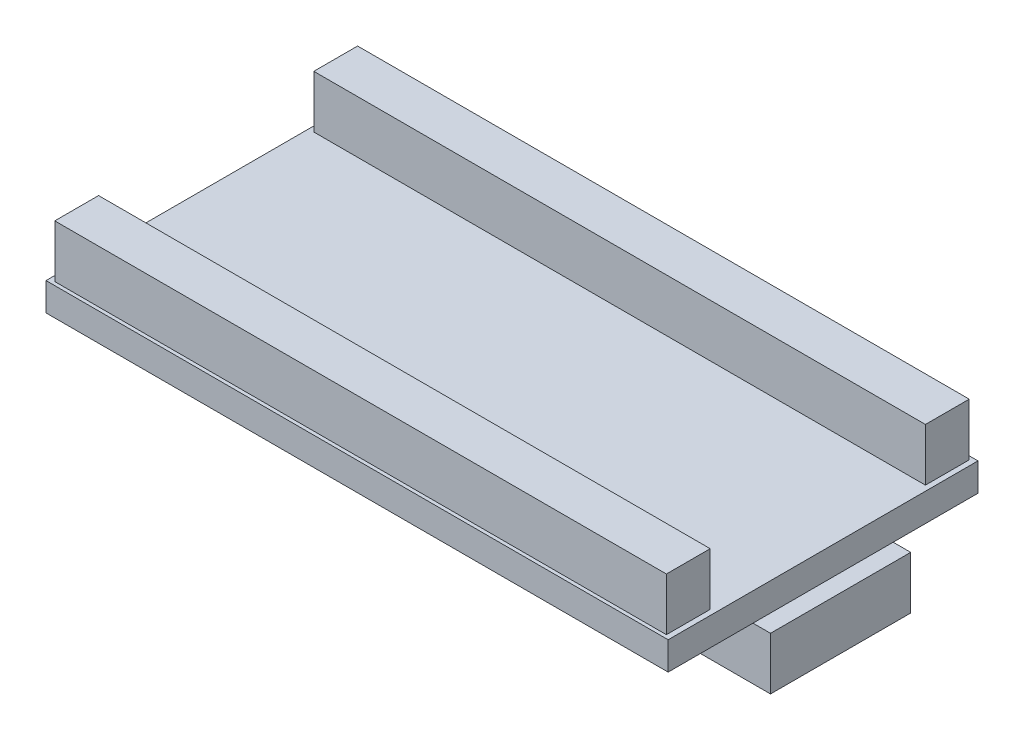
ISO-10303-21;
HEADER;
FILE_DESCRIPTION(('STEP AP214'),'2;1');
FILE_NAME('part.step','',(''),(''),'','','');
FILE_SCHEMA(('AUTOMOTIVE_DESIGN { 1 0 10303 214 1 1 1 1 }'));
ENDSEC;
DATA;
#1=APPLICATION_CONTEXT('core data for automotive mechanical design processes');
#2=APPLICATION_PROTOCOL_DEFINITION('international standard','automotive_design',2000,#1);
#3=PRODUCT_CONTEXT('',#1,'mechanical');
#4=PRODUCT('Part','Part','',(#3));
#5=PRODUCT_RELATED_PRODUCT_CATEGORY('part','',(#4));
#6=PRODUCT_DEFINITION_FORMATION('','',#4);
#7=PRODUCT_DEFINITION_CONTEXT('part definition',#1,'design');
#8=PRODUCT_DEFINITION('design','',#6,#7);
#9=PRODUCT_DEFINITION_SHAPE('','',#8);
#10=(LENGTH_UNIT() NAMED_UNIT(*) SI_UNIT(.MILLI.,.METRE.));
#11=(NAMED_UNIT(*) PLANE_ANGLE_UNIT() SI_UNIT($,.RADIAN.));
#12=(NAMED_UNIT(*) SI_UNIT($,.STERADIAN.) SOLID_ANGLE_UNIT());
#13=UNCERTAINTY_MEASURE_WITH_UNIT(LENGTH_MEASURE(1.E-05),#10,'distance_accuracy_value','');
#14=(GEOMETRIC_REPRESENTATION_CONTEXT(3) GLOBAL_UNCERTAINTY_ASSIGNED_CONTEXT((#13)) GLOBAL_UNIT_ASSIGNED_CONTEXT((#10,
#11,#12)) REPRESENTATION_CONTEXT('',''));
#15=CARTESIAN_POINT('',(0.,0.,0.));
#16=DIRECTION('',(0.,0.,1.));
#17=DIRECTION('',(1.,0.,0.));
#18=AXIS2_PLACEMENT_3D('',#15,#16,#17);
#19=CARTESIAN_POINT('',(0.,0.,0.));
#20=DIRECTION('',(0.,1.,0.));
#21=DIRECTION('',(0.,0.,1.));
#22=AXIS2_PLACEMENT_3D('',#19,#20,#21);
#23=PLANE('',#22);
#24=DIRECTION('',(-1.,0.,0.));
#25=VECTOR('',#24,1.);
#26=CARTESIAN_POINT('',(13.15,0.,4.));
#27=LINE('',#26,#25);
#28=CARTESIAN_POINT('',(17.75,0.,4.));
#29=VERTEX_POINT('',#28);
#30=CARTESIAN_POINT('',(13.15,0.,4.));
#31=VERTEX_POINT('',#30);
#32=EDGE_CURVE('E11',#29,#31,#27,.T.);
#33=ORIENTED_EDGE('',*,*,#32,.F.);
#34=DIRECTION('',(0.,0.,-1.));
#35=VECTOR('',#34,1.);
#36=CARTESIAN_POINT('',(17.75,0.,-8.84));
#37=LINE('',#36,#35);
#38=CARTESIAN_POINT('',(17.75,0.,8.84));
#39=VERTEX_POINT('',#38);
#40=EDGE_CURVE('E287',#39,#29,#37,.T.);
#41=ORIENTED_EDGE('',*,*,#40,.F.);
#42=DIRECTION('',(1.,0.,0.));
#43=VECTOR('',#42,1.);
#44=CARTESIAN_POINT('',(-17.75,0.,8.84));
#45=LINE('',#44,#43);
#46=CARTESIAN_POINT('',(-17.75,0.,8.84));
#47=VERTEX_POINT('',#46);
#48=EDGE_CURVE('E277',#47,#39,#45,.T.);
#49=ORIENTED_EDGE('',*,*,#48,.F.);
#50=DIRECTION('',(0.,0.,1.));
#51=VECTOR('',#50,1.);
#52=CARTESIAN_POINT('',(-17.75,0.,-8.84));
#53=LINE('',#52,#51);
#54=CARTESIAN_POINT('',(-17.75,0.,-8.84));
#55=VERTEX_POINT('',#54);
#56=EDGE_CURVE('E295',#55,#47,#53,.T.);
#57=ORIENTED_EDGE('',*,*,#56,.F.);
#58=DIRECTION('',(-1.,0.,0.));
#59=VECTOR('',#58,1.);
#60=CARTESIAN_POINT('',(-17.75,0.,-8.84));
#61=LINE('',#60,#59);
#62=CARTESIAN_POINT('',(17.75,0.,-8.84));
#63=VERTEX_POINT('',#62);
#64=EDGE_CURVE('E291',#63,#55,#61,.T.);
#65=ORIENTED_EDGE('',*,*,#64,.F.);
#66=CARTESIAN_POINT('',(17.75,0.,-4.));
#67=VERTEX_POINT('',#66);
#68=EDGE_CURVE('E271',#67,#63,#37,.T.);
#69=ORIENTED_EDGE('',*,*,#68,.F.);
#70=DIRECTION('',(1.,0.,0.));
#71=VECTOR('',#70,1.);
#72=CARTESIAN_POINT('',(13.15,0.,-4.));
#73=LINE('',#72,#71);
#74=CARTESIAN_POINT('',(13.15,0.,-4.));
#75=VERTEX_POINT('',#74);
#76=EDGE_CURVE('E61',#75,#67,#73,.T.);
#77=ORIENTED_EDGE('',*,*,#76,.F.);
#78=DIRECTION('',(0.,0.,-1.));
#79=VECTOR('',#78,1.);
#80=CARTESIAN_POINT('',(13.15,0.,4.));
#81=LINE('',#80,#79);
#82=EDGE_CURVE('E57',#31,#75,#81,.T.);
#83=ORIENTED_EDGE('',*,*,#82,.F.);
#84=EDGE_LOOP('',(#33,#41,#49,#57,#65,#69,#77,#83));
#85=FACE_BOUND('',#84,.T.);
#86=ADVANCED_FACE('F39',(#85),#23,.F.);
#87=CARTESIAN_POINT('',(0.,1.6,0.));
#88=DIRECTION('',(0.,1.,0.));
#89=DIRECTION('',(0.,0.,1.));
#90=AXIS2_PLACEMENT_3D('',#87,#88,#89);
#91=PLANE('',#90);
#92=DIRECTION('',(0.,0.,-1.));
#93=VECTOR('',#92,1.);
#94=CARTESIAN_POINT('',(17.75,1.6,-8.84));
#95=LINE('',#94,#93);
#96=CARTESIAN_POINT('',(17.75,1.6,8.84));
#97=VERTEX_POINT('',#96);
#98=CARTESIAN_POINT('',(17.75,1.6,-8.84));
#99=VERTEX_POINT('',#98);
#100=EDGE_CURVE('E272',#97,#99,#95,.T.);
#101=ORIENTED_EDGE('',*,*,#100,.T.);
#102=DIRECTION('',(-1.,0.,0.));
#103=VECTOR('',#102,1.);
#104=CARTESIAN_POINT('',(-17.75,1.6,-8.84));
#105=LINE('',#104,#103);
#106=CARTESIAN_POINT('',(-17.75,1.6,-8.84));
#107=VERTEX_POINT('',#106);
#108=EDGE_CURVE('E276',#99,#107,#105,.T.);
#109=ORIENTED_EDGE('',*,*,#108,.T.);
#110=DIRECTION('',(0.,0.,1.));
#111=VECTOR('',#110,1.);
#112=CARTESIAN_POINT('',(-17.75,1.6,-8.84));
#113=LINE('',#112,#111);
#114=CARTESIAN_POINT('',(-17.75,1.6,8.84));
#115=VERTEX_POINT('',#114);
#116=EDGE_CURVE('E280',#107,#115,#113,.T.);
#117=ORIENTED_EDGE('',*,*,#116,.T.);
#118=DIRECTION('',(1.,0.,0.));
#119=VECTOR('',#118,1.);
#120=CARTESIAN_POINT('',(-17.75,1.6,8.84));
#121=LINE('',#120,#119);
#122=EDGE_CURVE('E283',#115,#97,#121,.T.);
#123=ORIENTED_EDGE('',*,*,#122,.T.);
#124=EDGE_LOOP('',(#101,#109,#117,#123));
#125=FACE_BOUND('',#124,.T.);
#126=DIRECTION('',(1.,0.,0.));
#127=VECTOR('',#126,1.);
#128=CARTESIAN_POINT('',(-17.45,1.6,-6.14));
#129=LINE('',#128,#127);
#130=CARTESIAN_POINT('',(-17.45,1.6,-6.14));
#131=VERTEX_POINT('',#130);
#132=CARTESIAN_POINT('',(17.45,1.6,-6.14));
#133=VERTEX_POINT('',#132);
#134=EDGE_CURVE('E249',#131,#133,#129,.T.);
#135=ORIENTED_EDGE('',*,*,#134,.F.);
#136=DIRECTION('',(0.,0.,1.));
#137=VECTOR('',#136,1.);
#138=CARTESIAN_POINT('',(-17.45,1.6,-8.64));
#139=LINE('',#138,#137);
#140=CARTESIAN_POINT('',(-17.45,1.6,-8.64));
#141=VERTEX_POINT('',#140);
#142=EDGE_CURVE('E230',#141,#131,#139,.T.);
#143=ORIENTED_EDGE('',*,*,#142,.F.);
#144=DIRECTION('',(-1.,0.,0.));
#145=VECTOR('',#144,1.);
#146=CARTESIAN_POINT('',(-17.45,1.6,-8.64));
#147=LINE('',#146,#145);
#148=CARTESIAN_POINT('',(17.45,1.6,-8.64));
#149=VERTEX_POINT('',#148);
#150=EDGE_CURVE('E236',#149,#141,#147,.T.);
#151=ORIENTED_EDGE('',*,*,#150,.F.);
#152=DIRECTION('',(0.,0.,-1.));
#153=VECTOR('',#152,1.);
#154=CARTESIAN_POINT('',(17.45,1.6,-8.64));
#155=LINE('',#154,#153);
#156=EDGE_CURVE('E252',#133,#149,#155,.T.);
#157=ORIENTED_EDGE('',*,*,#156,.F.);
#158=EDGE_LOOP('',(#135,#143,#151,#157));
#159=FACE_BOUND('',#158,.T.);
#160=DIRECTION('',(-1.,0.,0.));
#161=VECTOR('',#160,1.);
#162=CARTESIAN_POINT('',(17.45,1.6,6.14));
#163=LINE('',#162,#161);
#164=CARTESIAN_POINT('',(17.45,1.6,6.14));
#165=VERTEX_POINT('',#164);
#166=CARTESIAN_POINT('',(-17.45,1.6,6.14000000000001));
#167=VERTEX_POINT('',#166);
#168=EDGE_CURVE('E188',#165,#167,#163,.T.);
#169=ORIENTED_EDGE('',*,*,#168,.F.);
#170=DIRECTION('',(0.,0.,-1.));
#171=VECTOR('',#170,1.);
#172=CARTESIAN_POINT('',(17.45,1.6,8.64));
#173=LINE('',#172,#171);
#174=CARTESIAN_POINT('',(17.45,1.6,8.64));
#175=VERTEX_POINT('',#174);
#176=EDGE_CURVE('E183',#175,#165,#173,.T.);
#177=ORIENTED_EDGE('',*,*,#176,.F.);
#178=DIRECTION('',(1.,0.,0.));
#179=VECTOR('',#178,1.);
#180=CARTESIAN_POINT('',(17.45,1.6,8.64));
#181=LINE('',#180,#179);
#182=CARTESIAN_POINT('',(-17.45,1.6,8.64000000000001));
#183=VERTEX_POINT('',#182);
#184=EDGE_CURVE('E199',#183,#175,#181,.T.);
#185=ORIENTED_EDGE('',*,*,#184,.F.);
#186=DIRECTION('',(0.,0.,1.));
#187=VECTOR('',#186,1.);
#188=CARTESIAN_POINT('',(-17.45,1.6,8.64000000000001));
#189=LINE('',#188,#187);
#190=EDGE_CURVE('E211',#167,#183,#189,.T.);
#191=ORIENTED_EDGE('',*,*,#190,.F.);
#192=EDGE_LOOP('',(#169,#177,#185,#191));
#193=FACE_BOUND('',#192,.T.);
#194=ADVANCED_FACE('F333',(#125,#159,#193),#91,.T.);
#195=CARTESIAN_POINT('',(17.75,1.6,-8.84));
#196=DIRECTION('',(-1.,0.,0.));
#197=DIRECTION('',(0.,0.,1.));
#198=AXIS2_PLACEMENT_3D('',#195,#196,#197);
#199=PLANE('',#198);
#200=ORIENTED_EDGE('',*,*,#40,.T.);
#201=EDGE_CURVE('E292',#29,#67,#37,.T.);
#202=ORIENTED_EDGE('',*,*,#201,.T.);
#203=ORIENTED_EDGE('',*,*,#68,.T.);
#204=DIRECTION('',(0.,-1.,0.));
#205=VECTOR('',#204,1.);
#206=CARTESIAN_POINT('',(17.75,1.6,-8.84));
#207=LINE('',#206,#205);
#208=EDGE_CURVE('E43',#99,#63,#207,.T.);
#209=ORIENTED_EDGE('',*,*,#208,.F.);
#210=ORIENTED_EDGE('',*,*,#100,.F.);
#211=DIRECTION('',(0.,-1.,0.));
#212=VECTOR('',#211,1.);
#213=CARTESIAN_POINT('',(17.75,1.6,8.84));
#214=LINE('',#213,#212);
#215=EDGE_CURVE('E286',#97,#39,#214,.T.);
#216=ORIENTED_EDGE('',*,*,#215,.T.);
#217=EDGE_LOOP('',(#200,#202,#203,#209,#210,#216));
#218=FACE_BOUND('',#217,.T.);
#219=ADVANCED_FACE('F41',(#218),#199,.F.);
#220=CARTESIAN_POINT('',(-17.75,1.6,-8.84));
#221=DIRECTION('',(0.,0.,1.));
#222=DIRECTION('',(1.,0.,0.));
#223=AXIS2_PLACEMENT_3D('',#220,#221,#222);
#224=PLANE('',#223);
#225=ORIENTED_EDGE('',*,*,#64,.T.);
#226=DIRECTION('',(0.,-1.,0.));
#227=VECTOR('',#226,1.);
#228=CARTESIAN_POINT('',(-17.75,1.6,-8.84));
#229=LINE('',#228,#227);
#230=EDGE_CURVE('E306',#107,#55,#229,.T.);
#231=ORIENTED_EDGE('',*,*,#230,.F.);
#232=ORIENTED_EDGE('',*,*,#108,.F.);
#233=ORIENTED_EDGE('',*,*,#208,.T.);
#234=EDGE_LOOP('',(#225,#231,#232,#233));
#235=FACE_BOUND('',#234,.T.);
#236=ADVANCED_FACE('F317',(#235),#224,.F.);
#237=CARTESIAN_POINT('',(-17.75,1.6,-8.84));
#238=DIRECTION('',(1.,0.,0.));
#239=DIRECTION('',(0.,0.,-1.));
#240=AXIS2_PLACEMENT_3D('',#237,#238,#239);
#241=PLANE('',#240);
#242=ORIENTED_EDGE('',*,*,#56,.T.);
#243=DIRECTION('',(0.,-1.,0.));
#244=VECTOR('',#243,1.);
#245=CARTESIAN_POINT('',(-17.75,1.6,8.84));
#246=LINE('',#245,#244);
#247=EDGE_CURVE('E303',#115,#47,#246,.T.);
#248=ORIENTED_EDGE('',*,*,#247,.F.);
#249=ORIENTED_EDGE('',*,*,#116,.F.);
#250=ORIENTED_EDGE('',*,*,#230,.T.);
#251=EDGE_LOOP('',(#242,#248,#249,#250));
#252=FACE_BOUND('',#251,.T.);
#253=ADVANCED_FACE('F327',(#252),#241,.F.);
#254=CARTESIAN_POINT('',(-17.75,1.6,8.84));
#255=DIRECTION('',(0.,0.,-1.));
#256=DIRECTION('',(-1.,0.,0.));
#257=AXIS2_PLACEMENT_3D('',#254,#255,#256);
#258=PLANE('',#257);
#259=ORIENTED_EDGE('',*,*,#48,.T.);
#260=ORIENTED_EDGE('',*,*,#215,.F.);
#261=ORIENTED_EDGE('',*,*,#122,.F.);
#262=ORIENTED_EDGE('',*,*,#247,.T.);
#263=EDGE_LOOP('',(#259,#260,#261,#262));
#264=FACE_BOUND('',#263,.T.);
#265=ADVANCED_FACE('F330',(#264),#258,.F.);
#266=CARTESIAN_POINT('',(-17.45,4.6,-8.64));
#267=DIRECTION('',(1.,0.,0.));
#268=DIRECTION('',(0.,0.,-1.));
#269=AXIS2_PLACEMENT_3D('',#266,#267,#268);
#270=PLANE('',#269);
#271=ORIENTED_EDGE('',*,*,#142,.T.);
#272=DIRECTION('',(0.,-1.,0.));
#273=VECTOR('',#272,1.);
#274=CARTESIAN_POINT('',(-17.45,4.6,-6.14));
#275=LINE('',#274,#273);
#276=CARTESIAN_POINT('',(-17.45,4.6,-6.14));
#277=VERTEX_POINT('',#276);
#278=EDGE_CURVE('E268',#277,#131,#275,.T.);
#279=ORIENTED_EDGE('',*,*,#278,.F.);
#280=DIRECTION('',(0.,0.,1.));
#281=VECTOR('',#280,1.);
#282=CARTESIAN_POINT('',(-17.45,4.6,-8.64));
#283=LINE('',#282,#281);
#284=CARTESIAN_POINT('',(-17.45,4.6,-8.64));
#285=VERTEX_POINT('',#284);
#286=EDGE_CURVE('E231',#285,#277,#283,.T.);
#287=ORIENTED_EDGE('',*,*,#286,.F.);
#288=DIRECTION('',(0.,-1.,0.));
#289=VECTOR('',#288,1.);
#290=CARTESIAN_POINT('',(-17.45,4.6,-8.64));
#291=LINE('',#290,#289);
#292=EDGE_CURVE('E245',#285,#141,#291,.T.);
#293=ORIENTED_EDGE('',*,*,#292,.T.);
#294=EDGE_LOOP('',(#271,#279,#287,#293));
#295=FACE_BOUND('',#294,.T.);
#296=ADVANCED_FACE('F378',(#295),#270,.F.);
#297=CARTESIAN_POINT('',(-17.45,4.6,-6.14));
#298=DIRECTION('',(0.,0.,-1.));
#299=DIRECTION('',(-1.,0.,0.));
#300=AXIS2_PLACEMENT_3D('',#297,#298,#299);
#301=PLANE('',#300);
#302=ORIENTED_EDGE('',*,*,#134,.T.);
#303=DIRECTION('',(0.,-1.,0.));
#304=VECTOR('',#303,1.);
#305=CARTESIAN_POINT('',(17.45,4.6,-6.14));
#306=LINE('',#305,#304);
#307=CARTESIAN_POINT('',(17.45,4.6,-6.14));
#308=VERTEX_POINT('',#307);
#309=EDGE_CURVE('E264',#308,#133,#306,.T.);
#310=ORIENTED_EDGE('',*,*,#309,.F.);
#311=DIRECTION('',(1.,0.,0.));
#312=VECTOR('',#311,1.);
#313=CARTESIAN_POINT('',(-17.45,4.6,-6.14));
#314=LINE('',#313,#312);
#315=EDGE_CURVE('E235',#277,#308,#314,.T.);
#316=ORIENTED_EDGE('',*,*,#315,.F.);
#317=ORIENTED_EDGE('',*,*,#278,.T.);
#318=EDGE_LOOP('',(#302,#310,#316,#317));
#319=FACE_BOUND('',#318,.T.);
#320=ADVANCED_FACE('F404',(#319),#301,.F.);
#321=CARTESIAN_POINT('',(17.45,4.6,-8.64));
#322=DIRECTION('',(-1.,0.,0.));
#323=DIRECTION('',(0.,0.,1.));
#324=AXIS2_PLACEMENT_3D('',#321,#322,#323);
#325=PLANE('',#324);
#326=ORIENTED_EDGE('',*,*,#156,.T.);
#327=DIRECTION('',(0.,-1.,0.));
#328=VECTOR('',#327,1.);
#329=CARTESIAN_POINT('',(17.45,4.6,-8.64));
#330=LINE('',#329,#328);
#331=CARTESIAN_POINT('',(17.45,4.6,-8.64));
#332=VERTEX_POINT('',#331);
#333=EDGE_CURVE('E261',#332,#149,#330,.T.);
#334=ORIENTED_EDGE('',*,*,#333,.F.);
#335=DIRECTION('',(0.,0.,-1.));
#336=VECTOR('',#335,1.);
#337=CARTESIAN_POINT('',(17.45,4.6,-8.64));
#338=LINE('',#337,#336);
#339=EDGE_CURVE('E239',#308,#332,#338,.T.);
#340=ORIENTED_EDGE('',*,*,#339,.F.);
#341=ORIENTED_EDGE('',*,*,#309,.T.);
#342=EDGE_LOOP('',(#326,#334,#340,#341));
#343=FACE_BOUND('',#342,.T.);
#344=ADVANCED_FACE('F413',(#343),#325,.F.);
#345=CARTESIAN_POINT('',(-17.45,4.6,-8.64));
#346=DIRECTION('',(0.,0.,1.));
#347=DIRECTION('',(1.,0.,0.));
#348=AXIS2_PLACEMENT_3D('',#345,#346,#347);
#349=PLANE('',#348);
#350=ORIENTED_EDGE('',*,*,#150,.T.);
#351=ORIENTED_EDGE('',*,*,#292,.F.);
#352=DIRECTION('',(-1.,0.,0.));
#353=VECTOR('',#352,1.);
#354=CARTESIAN_POINT('',(-17.45,4.6,-8.64));
#355=LINE('',#354,#353);
#356=EDGE_CURVE('E242',#332,#285,#355,.T.);
#357=ORIENTED_EDGE('',*,*,#356,.F.);
#358=ORIENTED_EDGE('',*,*,#333,.T.);
#359=EDGE_LOOP('',(#350,#351,#357,#358));
#360=FACE_BOUND('',#359,.T.);
#361=ADVANCED_FACE('F423',(#360),#349,.F.);
#362=CARTESIAN_POINT('',(0.,4.6,0.));
#363=DIRECTION('',(0.,1.,0.));
#364=DIRECTION('',(0.,0.,1.));
#365=AXIS2_PLACEMENT_3D('',#362,#363,#364);
#366=PLANE('',#365);
#367=ORIENTED_EDGE('',*,*,#286,.T.);
#368=ORIENTED_EDGE('',*,*,#315,.T.);
#369=ORIENTED_EDGE('',*,*,#339,.T.);
#370=ORIENTED_EDGE('',*,*,#356,.T.);
#371=EDGE_LOOP('',(#367,#368,#369,#370));
#372=FACE_BOUND('',#371,.T.);
#373=ADVANCED_FACE('F433',(#372),#366,.T.);
#374=CARTESIAN_POINT('',(17.45,4.6,8.64));
#375=DIRECTION('',(-1.,0.,0.));
#376=DIRECTION('',(0.,0.,1.));
#377=AXIS2_PLACEMENT_3D('',#374,#375,#376);
#378=PLANE('',#377);
#379=ORIENTED_EDGE('',*,*,#176,.T.);
#380=DIRECTION('',(0.,-1.,0.));
#381=VECTOR('',#380,1.);
#382=CARTESIAN_POINT('',(17.45,4.6,6.14));
#383=LINE('',#382,#381);
#384=CARTESIAN_POINT('',(17.45,4.6,6.14));
#385=VERTEX_POINT('',#384);
#386=EDGE_CURVE('E227',#385,#165,#383,.T.);
#387=ORIENTED_EDGE('',*,*,#386,.F.);
#388=DIRECTION('',(0.,0.,-1.));
#389=VECTOR('',#388,1.);
#390=CARTESIAN_POINT('',(17.45,4.6,8.64));
#391=LINE('',#390,#389);
#392=CARTESIAN_POINT('',(17.45,4.6,8.64));
#393=VERTEX_POINT('',#392);
#394=EDGE_CURVE('E194',#393,#385,#391,.T.);
#395=ORIENTED_EDGE('',*,*,#394,.F.);
#396=DIRECTION('',(0.,-1.,0.));
#397=VECTOR('',#396,1.);
#398=CARTESIAN_POINT('',(17.45,4.6,8.64));
#399=LINE('',#398,#397);
#400=EDGE_CURVE('E207',#393,#175,#399,.T.);
#401=ORIENTED_EDGE('',*,*,#400,.T.);
#402=EDGE_LOOP('',(#379,#387,#395,#401));
#403=FACE_BOUND('',#402,.T.);
#404=ADVANCED_FACE('F359',(#403),#378,.F.);
#405=CARTESIAN_POINT('',(17.45,4.6,6.14));
#406=DIRECTION('',(0.,0.,1.));
#407=DIRECTION('',(1.,0.,0.));
#408=AXIS2_PLACEMENT_3D('',#405,#406,#407);
#409=PLANE('',#408);
#410=ORIENTED_EDGE('',*,*,#168,.T.);
#411=DIRECTION('',(0.,-1.,0.));
#412=VECTOR('',#411,1.);
#413=CARTESIAN_POINT('',(-17.45,4.6,6.14000000000001));
#414=LINE('',#413,#412);
#415=CARTESIAN_POINT('',(-17.45,4.6,6.14000000000001));
#416=VERTEX_POINT('',#415);
#417=EDGE_CURVE('E223',#416,#167,#414,.T.);
#418=ORIENTED_EDGE('',*,*,#417,.F.);
#419=DIRECTION('',(-1.,0.,0.));
#420=VECTOR('',#419,1.);
#421=CARTESIAN_POINT('',(17.45,4.6,6.14));
#422=LINE('',#421,#420);
#423=EDGE_CURVE('E198',#385,#416,#422,.T.);
#424=ORIENTED_EDGE('',*,*,#423,.F.);
#425=ORIENTED_EDGE('',*,*,#386,.T.);
#426=EDGE_LOOP('',(#410,#418,#424,#425));
#427=FACE_BOUND('',#426,.T.);
#428=ADVANCED_FACE('F347',(#427),#409,.F.);
#429=CARTESIAN_POINT('',(-17.45,4.6,8.64000000000001));
#430=DIRECTION('',(1.,0.,0.));
#431=DIRECTION('',(0.,0.,-1.));
#432=AXIS2_PLACEMENT_3D('',#429,#430,#431);
#433=PLANE('',#432);
#434=ORIENTED_EDGE('',*,*,#190,.T.);
#435=DIRECTION('',(0.,-1.,0.));
#436=VECTOR('',#435,1.);
#437=CARTESIAN_POINT('',(-17.45,4.6,8.64000000000001));
#438=LINE('',#437,#436);
#439=CARTESIAN_POINT('',(-17.45,4.6,8.64000000000001));
#440=VERTEX_POINT('',#439);
#441=EDGE_CURVE('E220',#440,#183,#438,.T.);
#442=ORIENTED_EDGE('',*,*,#441,.F.);
#443=DIRECTION('',(0.,0.,1.));
#444=VECTOR('',#443,1.);
#445=CARTESIAN_POINT('',(-17.45,4.6,8.64000000000001));
#446=LINE('',#445,#444);
#447=EDGE_CURVE('E202',#416,#440,#446,.T.);
#448=ORIENTED_EDGE('',*,*,#447,.F.);
#449=ORIENTED_EDGE('',*,*,#417,.T.);
#450=EDGE_LOOP('',(#434,#442,#448,#449));
#451=FACE_BOUND('',#450,.T.);
#452=ADVANCED_FACE('F351',(#451),#433,.F.);
#453=CARTESIAN_POINT('',(17.45,4.6,8.64));
#454=DIRECTION('',(0.,0.,-1.));
#455=DIRECTION('',(-1.,0.,0.));
#456=AXIS2_PLACEMENT_3D('',#453,#454,#455);
#457=PLANE('',#456);
#458=ORIENTED_EDGE('',*,*,#184,.T.);
#459=ORIENTED_EDGE('',*,*,#400,.F.);
#460=DIRECTION('',(1.,0.,0.));
#461=VECTOR('',#460,1.);
#462=CARTESIAN_POINT('',(17.45,4.6,8.64));
#463=LINE('',#462,#461);
#464=EDGE_CURVE('E205',#440,#393,#463,.T.);
#465=ORIENTED_EDGE('',*,*,#464,.F.);
#466=ORIENTED_EDGE('',*,*,#441,.T.);
#467=EDGE_LOOP('',(#458,#459,#465,#466));
#468=FACE_BOUND('',#467,.T.);
#469=ADVANCED_FACE('F361',(#468),#457,.F.);
#470=CARTESIAN_POINT('',(0.,4.6,0.));
#471=DIRECTION('',(0.,1.,0.));
#472=DIRECTION('',(0.,0.,1.));
#473=AXIS2_PLACEMENT_3D('',#470,#471,#472);
#474=PLANE('',#473);
#475=ORIENTED_EDGE('',*,*,#394,.T.);
#476=ORIENTED_EDGE('',*,*,#423,.T.);
#477=ORIENTED_EDGE('',*,*,#447,.T.);
#478=ORIENTED_EDGE('',*,*,#464,.T.);
#479=EDGE_LOOP('',(#475,#476,#477,#478));
#480=FACE_BOUND('',#479,.T.);
#481=ADVANCED_FACE('F355',(#480),#474,.T.);
#482=CARTESIAN_POINT('',(13.15,-3.,4.));
#483=DIRECTION('',(1.,0.,0.));
#484=DIRECTION('',(0.,0.,-1.));
#485=AXIS2_PLACEMENT_3D('',#482,#483,#484);
#486=PLANE('',#485);
#487=ORIENTED_EDGE('',*,*,#82,.T.);
#488=DIRECTION('',(0.,1.,0.));
#489=VECTOR('',#488,1.);
#490=CARTESIAN_POINT('',(13.15,-3.,-4.));
#491=LINE('',#490,#489);
#492=CARTESIAN_POINT('',(13.15,-3.,-4.));
#493=VERTEX_POINT('',#492);
#494=EDGE_CURVE('E163',#493,#75,#491,.T.);
#495=ORIENTED_EDGE('',*,*,#494,.F.);
#496=DIRECTION('',(0.,0.,-1.));
#497=VECTOR('',#496,1.);
#498=CARTESIAN_POINT('',(13.15,-3.,4.));
#499=LINE('',#498,#497);
#500=CARTESIAN_POINT('',(13.15,-3.,4.));
#501=VERTEX_POINT('',#500);
#502=EDGE_CURVE('E170',#501,#493,#499,.T.);
#503=ORIENTED_EDGE('',*,*,#502,.F.);
#504=DIRECTION('',(0.,1.,0.));
#505=VECTOR('',#504,1.);
#506=CARTESIAN_POINT('',(13.15,-3.,4.));
#507=LINE('',#506,#505);
#508=EDGE_CURVE('E549',#501,#31,#507,.T.);
#509=ORIENTED_EDGE('',*,*,#508,.T.);
#510=EDGE_LOOP('',(#487,#495,#503,#509));
#511=FACE_BOUND('',#510,.T.);
#512=ADVANCED_FACE('F181',(#511),#486,.F.);
#513=CARTESIAN_POINT('',(13.15,-3.,-4.));
#514=DIRECTION('',(0.,0.,1.));
#515=DIRECTION('',(1.,0.,0.));
#516=AXIS2_PLACEMENT_3D('',#513,#514,#515);
#517=PLANE('',#516);
#518=ORIENTED_EDGE('',*,*,#76,.T.);
#519=CARTESIAN_POINT('',(18.75,0.,-4.));
#520=VERTEX_POINT('',#519);
#521=EDGE_CURVE('E539',#67,#520,#73,.T.);
#522=ORIENTED_EDGE('',*,*,#521,.T.);
#523=DIRECTION('',(0.,1.,0.));
#524=VECTOR('',#523,1.);
#525=CARTESIAN_POINT('',(18.75,-3.,-4.));
#526=LINE('',#525,#524);
#527=CARTESIAN_POINT('',(18.75,-3.,-4.));
#528=VERTEX_POINT('',#527);
#529=EDGE_CURVE('E165',#528,#520,#526,.T.);
#530=ORIENTED_EDGE('',*,*,#529,.F.);
#531=DIRECTION('',(1.,0.,0.));
#532=VECTOR('',#531,1.);
#533=CARTESIAN_POINT('',(13.15,-3.,-4.));
#534=LINE('',#533,#532);
#535=EDGE_CURVE('E159',#493,#528,#534,.T.);
#536=ORIENTED_EDGE('',*,*,#535,.F.);
#537=ORIENTED_EDGE('',*,*,#494,.T.);
#538=EDGE_LOOP('',(#518,#522,#530,#536,#537));
#539=FACE_BOUND('',#538,.T.);
#540=ADVANCED_FACE('F161',(#539),#517,.F.);
#541=CARTESIAN_POINT('',(18.75,-3.,4.));
#542=DIRECTION('',(-1.,0.,0.));
#543=DIRECTION('',(0.,0.,1.));
#544=AXIS2_PLACEMENT_3D('',#541,#542,#543);
#545=PLANE('',#544);
#546=DIRECTION('',(0.,0.,1.));
#547=VECTOR('',#546,1.);
#548=CARTESIAN_POINT('',(18.75,0.,4.));
#549=LINE('',#548,#547);
#550=CARTESIAN_POINT('',(18.75,0.,4.));
#551=VERTEX_POINT('',#550);
#552=EDGE_CURVE('E544',#520,#551,#549,.T.);
#553=ORIENTED_EDGE('',*,*,#552,.T.);
#554=DIRECTION('',(0.,1.,0.));
#555=VECTOR('',#554,1.);
#556=CARTESIAN_POINT('',(18.75,-3.,4.));
#557=LINE('',#556,#555);
#558=CARTESIAN_POINT('',(18.75,-3.,4.));
#559=VERTEX_POINT('',#558);
#560=EDGE_CURVE('E190',#559,#551,#557,.T.);
#561=ORIENTED_EDGE('',*,*,#560,.F.);
#562=DIRECTION('',(0.,0.,1.));
#563=VECTOR('',#562,1.);
#564=CARTESIAN_POINT('',(18.75,-3.,4.));
#565=LINE('',#564,#563);
#566=EDGE_CURVE('E169',#528,#559,#565,.T.);
#567=ORIENTED_EDGE('',*,*,#566,.F.);
#568=ORIENTED_EDGE('',*,*,#529,.T.);
#569=EDGE_LOOP('',(#553,#561,#567,#568));
#570=FACE_BOUND('',#569,.T.);
#571=ADVANCED_FACE('F495',(#570),#545,.F.);
#572=CARTESIAN_POINT('',(13.15,-3.,4.));
#573=DIRECTION('',(0.,0.,-1.));
#574=DIRECTION('',(-1.,0.,0.));
#575=AXIS2_PLACEMENT_3D('',#572,#573,#574);
#576=PLANE('',#575);
#577=EDGE_CURVE('E50',#551,#29,#27,.T.);
#578=ORIENTED_EDGE('',*,*,#577,.T.);
#579=ORIENTED_EDGE('',*,*,#32,.T.);
#580=ORIENTED_EDGE('',*,*,#508,.F.);
#581=DIRECTION('',(-1.,0.,0.));
#582=VECTOR('',#581,1.);
#583=CARTESIAN_POINT('',(13.15,-3.,4.));
#584=LINE('',#583,#582);
#585=EDGE_CURVE('E175',#559,#501,#584,.T.);
#586=ORIENTED_EDGE('',*,*,#585,.F.);
#587=ORIENTED_EDGE('',*,*,#560,.T.);
#588=EDGE_LOOP('',(#578,#579,#580,#586,#587));
#589=FACE_BOUND('',#588,.T.);
#590=ADVANCED_FACE('F503',(#589),#576,.F.);
#591=CARTESIAN_POINT('',(0.,-3.,0.));
#592=DIRECTION('',(0.,-1.,0.));
#593=DIRECTION('',(0.,0.,-1.));
#594=AXIS2_PLACEMENT_3D('',#591,#592,#593);
#595=PLANE('',#594);
#596=ORIENTED_EDGE('',*,*,#502,.T.);
#597=ORIENTED_EDGE('',*,*,#535,.T.);
#598=ORIENTED_EDGE('',*,*,#566,.T.);
#599=ORIENTED_EDGE('',*,*,#585,.T.);
#600=EDGE_LOOP('',(#596,#597,#598,#599));
#601=FACE_BOUND('',#600,.T.);
#602=ADVANCED_FACE('F173',(#601),#595,.T.);
#603=CARTESIAN_POINT('',(0.,0.,0.));
#604=DIRECTION('',(0.,-1.,0.));
#605=DIRECTION('',(0.,0.,-1.));
#606=AXIS2_PLACEMENT_3D('',#603,#604,#605);
#607=PLANE('',#606);
#608=ORIENTED_EDGE('',*,*,#201,.F.);
#609=ORIENTED_EDGE('',*,*,#577,.F.);
#610=ORIENTED_EDGE('',*,*,#552,.F.);
#611=ORIENTED_EDGE('',*,*,#521,.F.);
#612=EDGE_LOOP('',(#608,#609,#610,#611));
#613=FACE_BOUND('',#612,.T.);
#614=ADVANCED_FACE('F520',(#613),#607,.F.);
#615=CLOSED_SHELL('',(#86,#194,#219,#236,#253,#265,#296,#320,#344,#361,#373,#404,#428,#452,#469,
#481,#512,#540,#571,#590,#602,#614));
#616=MANIFOLD_SOLID_BREP('B2',#615);
#617=ADVANCED_BREP_SHAPE_REPRESENTATION('',(#18,#616),#14);
#618=SHAPE_DEFINITION_REPRESENTATION(#9,#617);
ENDSEC;
END-ISO-10303-21;
